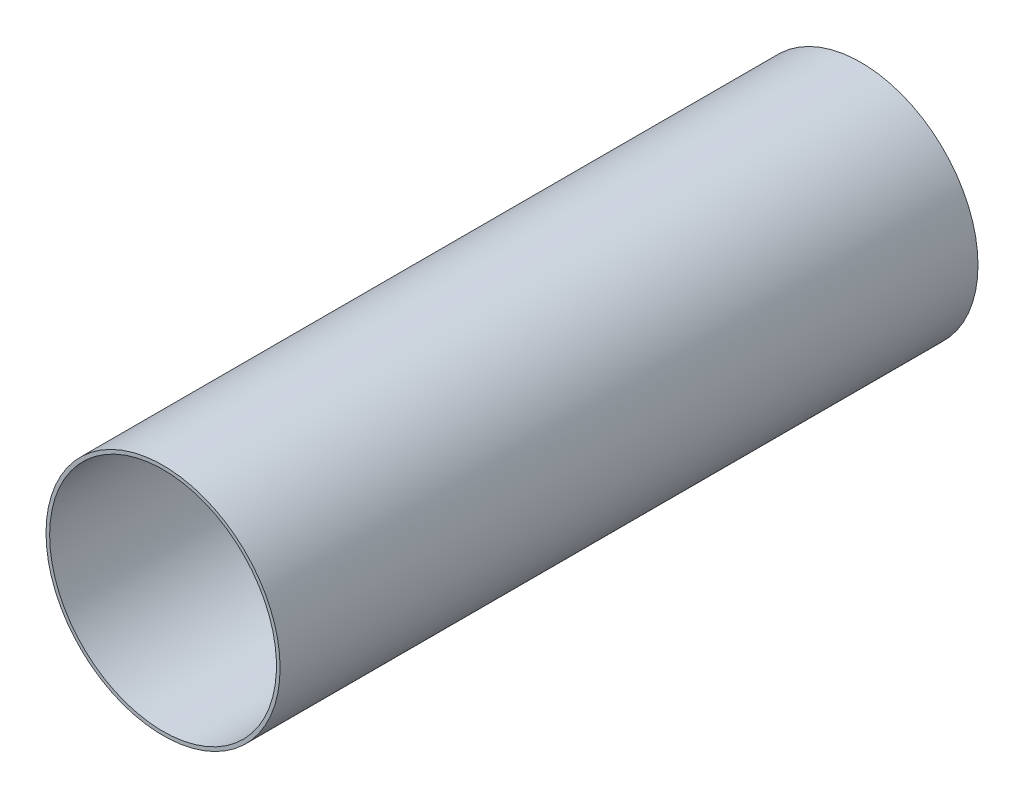
ISO-10303-21;
HEADER;
FILE_DESCRIPTION(('STEP AP214'),'2;1');
FILE_NAME('part.step','',(''),(''),'','','');
FILE_SCHEMA(('AUTOMOTIVE_DESIGN { 1 0 10303 214 1 1 1 1 }'));
ENDSEC;
DATA;
#1=APPLICATION_CONTEXT('core data for automotive mechanical design processes');
#2=APPLICATION_PROTOCOL_DEFINITION('international standard','automotive_design',2000,#1);
#3=PRODUCT_CONTEXT('',#1,'mechanical');
#4=PRODUCT('Part','Part','',(#3));
#5=PRODUCT_RELATED_PRODUCT_CATEGORY('part','',(#4));
#6=PRODUCT_DEFINITION_FORMATION('','',#4);
#7=PRODUCT_DEFINITION_CONTEXT('part definition',#1,'design');
#8=PRODUCT_DEFINITION('design','',#6,#7);
#9=PRODUCT_DEFINITION_SHAPE('','',#8);
#10=(LENGTH_UNIT() NAMED_UNIT(*) SI_UNIT(.MILLI.,.METRE.));
#11=(NAMED_UNIT(*) PLANE_ANGLE_UNIT() SI_UNIT($,.RADIAN.));
#12=(NAMED_UNIT(*) SI_UNIT($,.STERADIAN.) SOLID_ANGLE_UNIT());
#13=UNCERTAINTY_MEASURE_WITH_UNIT(LENGTH_MEASURE(1.E-05),#10,'distance_accuracy_value','');
#14=(GEOMETRIC_REPRESENTATION_CONTEXT(3) GLOBAL_UNCERTAINTY_ASSIGNED_CONTEXT((#13)) GLOBAL_UNIT_ASSIGNED_CONTEXT((#10,
#11,#12)) REPRESENTATION_CONTEXT('',''));
#15=CARTESIAN_POINT('',(0.,0.,0.));
#16=DIRECTION('',(0.,0.,1.));
#17=DIRECTION('',(1.,0.,0.));
#18=AXIS2_PLACEMENT_3D('',#15,#16,#17);
#19=CARTESIAN_POINT('',(0.,0.,304.8));
#20=DIRECTION('',(0.,0.,1.));
#21=DIRECTION('',(1.,0.,0.));
#22=AXIS2_PLACEMENT_3D('',#19,#20,#21);
#23=PLANE('',#22);
#24=CARTESIAN_POINT('',(0.,0.,304.8));
#25=DIRECTION('',(0.,0.,1.));
#26=DIRECTION('',(1.,0.,0.));
#27=AXIS2_PLACEMENT_3D('',#24,#25,#26);
#28=CIRCLE('',#27,51.1175);
#29=CARTESIAN_POINT('',(-51.1175,0.,304.8));
#30=VERTEX_POINT('',#29);
#31=EDGE_CURVE('E10',#30,#30,#28,.T.);
#32=ORIENTED_EDGE('',*,*,#31,.T.);
#33=EDGE_LOOP('',(#32));
#34=FACE_BOUND('',#33,.T.);
#35=CARTESIAN_POINT('',(0.,0.,304.8));
#36=DIRECTION('',(0.,0.,1.));
#37=DIRECTION('',(1.,0.,0.));
#38=AXIS2_PLACEMENT_3D('',#35,#36,#37);
#39=CIRCLE('',#38,49.53);
#40=CARTESIAN_POINT('',(-49.53,0.,304.8));
#41=VERTEX_POINT('',#40);
#42=EDGE_CURVE('E42',#41,#41,#39,.T.);
#43=ORIENTED_EDGE('',*,*,#42,.F.);
#44=EDGE_LOOP('',(#43));
#45=FACE_BOUND('',#44,.T.);
#46=ADVANCED_FACE('F31',(#34,#45),#23,.T.);
#47=CARTESIAN_POINT('',(0.,0.,0.));
#48=DIRECTION('',(0.,0.,1.));
#49=DIRECTION('',(1.,0.,0.));
#50=AXIS2_PLACEMENT_3D('',#47,#48,#49);
#51=PLANE('',#50);
#52=CARTESIAN_POINT('',(0.,0.,0.));
#53=DIRECTION('',(0.,0.,1.));
#54=DIRECTION('',(1.,0.,0.));
#55=AXIS2_PLACEMENT_3D('',#52,#53,#54);
#56=CIRCLE('',#55,51.1175);
#57=CARTESIAN_POINT('',(-51.1175,0.,0.));
#58=VERTEX_POINT('',#57);
#59=EDGE_CURVE('E35',#58,#58,#56,.T.);
#60=ORIENTED_EDGE('',*,*,#59,.F.);
#61=EDGE_LOOP('',(#60));
#62=FACE_BOUND('',#61,.T.);
#63=CARTESIAN_POINT('',(0.,0.,0.));
#64=DIRECTION('',(0.,0.,1.));
#65=DIRECTION('',(1.,0.,0.));
#66=AXIS2_PLACEMENT_3D('',#63,#64,#65);
#67=CIRCLE('',#66,49.53);
#68=CARTESIAN_POINT('',(-49.53,0.,0.));
#69=VERTEX_POINT('',#68);
#70=EDGE_CURVE('E44',#69,#69,#67,.T.);
#71=ORIENTED_EDGE('',*,*,#70,.T.);
#72=EDGE_LOOP('',(#71));
#73=FACE_BOUND('',#72,.T.);
#74=ADVANCED_FACE('F54',(#62,#73),#51,.F.);
#75=CARTESIAN_POINT('',(0.,0.,304.8));
#76=DIRECTION('',(0.,0.,-1.));
#77=DIRECTION('',(-1.,0.,0.));
#78=AXIS2_PLACEMENT_3D('',#75,#76,#77);
#79=CYLINDRICAL_SURFACE('',#78,51.1175);
#80=CARTESIAN_POINT('',(-51.1175,0.,304.8));
#81=CARTESIAN_POINT('',(-51.1175,0.,301.625));
#82=CARTESIAN_POINT('',(-51.1175,0.,298.45));
#83=CARTESIAN_POINT('',(-51.1175,0.,292.1));
#84=CARTESIAN_POINT('',(-51.1175,0.,288.925));
#85=CARTESIAN_POINT('',(-51.1175,0.,282.575));
#86=CARTESIAN_POINT('',(-51.1175,0.,279.4));
#87=CARTESIAN_POINT('',(-51.1175,0.,273.05));
#88=CARTESIAN_POINT('',(-51.1175,0.,269.875));
#89=CARTESIAN_POINT('',(-51.1175,0.,263.525));
#90=CARTESIAN_POINT('',(-51.1175,0.,260.35));
#91=CARTESIAN_POINT('',(-51.1175,0.,254.));
#92=CARTESIAN_POINT('',(-51.1175,0.,250.825));
#93=CARTESIAN_POINT('',(-51.1175,0.,244.475));
#94=CARTESIAN_POINT('',(-51.1175,0.,241.3));
#95=CARTESIAN_POINT('',(-51.1175,0.,234.95));
#96=CARTESIAN_POINT('',(-51.1175,0.,231.775));
#97=CARTESIAN_POINT('',(-51.1175,0.,225.425));
#98=CARTESIAN_POINT('',(-51.1175,0.,222.25));
#99=CARTESIAN_POINT('',(-51.1175,0.,215.9));
#100=CARTESIAN_POINT('',(-51.1175,0.,212.725));
#101=CARTESIAN_POINT('',(-51.1175,0.,206.375));
#102=CARTESIAN_POINT('',(-51.1175,0.,203.2));
#103=CARTESIAN_POINT('',(-51.1175,0.,196.85));
#104=CARTESIAN_POINT('',(-51.1175,0.,193.675));
#105=CARTESIAN_POINT('',(-51.1175,0.,187.325));
#106=CARTESIAN_POINT('',(-51.1175,0.,184.15));
#107=CARTESIAN_POINT('',(-51.1175,0.,177.8));
#108=CARTESIAN_POINT('',(-51.1175,0.,174.625));
#109=CARTESIAN_POINT('',(-51.1175,0.,168.275));
#110=CARTESIAN_POINT('',(-51.1175,0.,165.1));
#111=CARTESIAN_POINT('',(-51.1175,0.,158.75));
#112=CARTESIAN_POINT('',(-51.1175,0.,155.575));
#113=CARTESIAN_POINT('',(-51.1175,0.,149.225));
#114=CARTESIAN_POINT('',(-51.1175,0.,146.05));
#115=CARTESIAN_POINT('',(-51.1175,0.,139.7));
#116=CARTESIAN_POINT('',(-51.1175,0.,136.525));
#117=CARTESIAN_POINT('',(-51.1175,0.,130.175));
#118=CARTESIAN_POINT('',(-51.1175,0.,127.));
#119=CARTESIAN_POINT('',(-51.1175,0.,120.65));
#120=CARTESIAN_POINT('',(-51.1175,0.,117.475));
#121=CARTESIAN_POINT('',(-51.1175,0.,111.125));
#122=CARTESIAN_POINT('',(-51.1175,0.,107.95));
#123=CARTESIAN_POINT('',(-51.1175,0.,101.6));
#124=CARTESIAN_POINT('',(-51.1175,0.,98.425));
#125=CARTESIAN_POINT('',(-51.1175,0.,92.075));
#126=CARTESIAN_POINT('',(-51.1175,0.,88.9));
#127=CARTESIAN_POINT('',(-51.1175,0.,82.55));
#128=CARTESIAN_POINT('',(-51.1175,0.,79.375));
#129=CARTESIAN_POINT('',(-51.1175,0.,73.025));
#130=CARTESIAN_POINT('',(-51.1175,0.,69.85));
#131=CARTESIAN_POINT('',(-51.1175,0.,63.5));
#132=CARTESIAN_POINT('',(-51.1175,0.,60.325));
#133=CARTESIAN_POINT('',(-51.1175,0.,53.975));
#134=CARTESIAN_POINT('',(-51.1175,0.,50.8));
#135=CARTESIAN_POINT('',(-51.1175,0.,44.45));
#136=CARTESIAN_POINT('',(-51.1175,0.,41.275));
#137=CARTESIAN_POINT('',(-51.1175,0.,34.925));
#138=CARTESIAN_POINT('',(-51.1175,0.,31.75));
#139=CARTESIAN_POINT('',(-51.1175,0.,25.4));
#140=CARTESIAN_POINT('',(-51.1175,0.,22.225));
#141=CARTESIAN_POINT('',(-51.1175,0.,15.875));
#142=CARTESIAN_POINT('',(-51.1175,0.,12.7));
#143=CARTESIAN_POINT('',(-51.1175,0.,6.35));
#144=CARTESIAN_POINT('',(-51.1175,0.,3.175));
#145=CARTESIAN_POINT('',(-51.1175,0.,0.));
#146=B_SPLINE_CURVE_WITH_KNOTS('',3,(#80,#81,#82,#83,#84,#85,#86,#87,#88,#89,#90,#91,#92,#93,
#94,#95,#96,#97,#98,#99,#100,#101,#102,#103,#104,#105,#106,#107,#108,#109,#110,#111,#112,#113,
#114,#115,#116,#117,#118,#119,#120,#121,#122,#123,#124,#125,#126,#127,#128,#129,#130,#131,#132,
#133,#134,#135,#136,#137,#138,#139,#140,#141,#142,#143,#144,#145),.UNSPECIFIED.,.F.,.F.,(4,2,2,
2,2,2,2,2,2,2,2,2,2,2,2,2,2,2,2,2,2,2,2,2,2,2,2,2,2,2,2,2,4),(0.,9.52499999999995,19.05,28.575,
38.1,47.625,57.15,66.675,76.2,85.725,95.2499999999999,104.775,114.3,123.825,133.35,142.875,
152.4,161.925,171.45,180.975,190.5,200.025,209.55,219.075,228.6,238.125,247.65,257.175,266.7,
276.225,285.75,295.275,304.8),.UNSPECIFIED.);
#147=EDGE_CURVE('BSEAM33',#30,#58,#146,.T.);
#148=ORIENTED_EDGE('',*,*,#31,.F.);
#149=ORIENTED_EDGE('',*,*,#59,.T.);
#150=ORIENTED_EDGE('',*,*,#147,.T.);
#151=ORIENTED_EDGE('',*,*,#147,.F.);
#152=EDGE_LOOP('',(#148,#150,#149,#151));
#153=FACE_BOUND('',#152,.T.);
#154=ADVANCED_FACE('F33',(#153),#79,.T.);
#155=CARTESIAN_POINT('',(0.,0.,304.8));
#156=DIRECTION('',(0.,0.,-1.));
#157=DIRECTION('',(-1.,0.,0.));
#158=AXIS2_PLACEMENT_3D('',#155,#156,#157);
#159=CYLINDRICAL_SURFACE('',#158,49.53);
#160=CARTESIAN_POINT('',(-49.53,0.,304.8));
#161=CARTESIAN_POINT('',(-49.53,0.,301.625));
#162=CARTESIAN_POINT('',(-49.53,0.,298.45));
#163=CARTESIAN_POINT('',(-49.53,0.,292.1));
#164=CARTESIAN_POINT('',(-49.53,0.,288.925));
#165=CARTESIAN_POINT('',(-49.53,0.,282.575));
#166=CARTESIAN_POINT('',(-49.53,0.,279.4));
#167=CARTESIAN_POINT('',(-49.53,0.,273.05));
#168=CARTESIAN_POINT('',(-49.53,0.,269.875));
#169=CARTESIAN_POINT('',(-49.53,0.,263.525));
#170=CARTESIAN_POINT('',(-49.53,0.,260.35));
#171=CARTESIAN_POINT('',(-49.53,0.,254.));
#172=CARTESIAN_POINT('',(-49.53,0.,250.825));
#173=CARTESIAN_POINT('',(-49.53,0.,244.475));
#174=CARTESIAN_POINT('',(-49.53,0.,241.3));
#175=CARTESIAN_POINT('',(-49.53,0.,234.95));
#176=CARTESIAN_POINT('',(-49.53,0.,231.775));
#177=CARTESIAN_POINT('',(-49.53,0.,225.425));
#178=CARTESIAN_POINT('',(-49.53,0.,222.25));
#179=CARTESIAN_POINT('',(-49.53,0.,215.9));
#180=CARTESIAN_POINT('',(-49.53,0.,212.725));
#181=CARTESIAN_POINT('',(-49.53,0.,206.375));
#182=CARTESIAN_POINT('',(-49.53,0.,203.2));
#183=CARTESIAN_POINT('',(-49.53,0.,196.85));
#184=CARTESIAN_POINT('',(-49.53,0.,193.675));
#185=CARTESIAN_POINT('',(-49.53,0.,187.325));
#186=CARTESIAN_POINT('',(-49.53,0.,184.15));
#187=CARTESIAN_POINT('',(-49.53,0.,177.8));
#188=CARTESIAN_POINT('',(-49.53,0.,174.625));
#189=CARTESIAN_POINT('',(-49.53,0.,168.275));
#190=CARTESIAN_POINT('',(-49.53,0.,165.1));
#191=CARTESIAN_POINT('',(-49.53,0.,158.75));
#192=CARTESIAN_POINT('',(-49.53,0.,155.575));
#193=CARTESIAN_POINT('',(-49.53,0.,149.225));
#194=CARTESIAN_POINT('',(-49.53,0.,146.05));
#195=CARTESIAN_POINT('',(-49.53,0.,139.7));
#196=CARTESIAN_POINT('',(-49.53,0.,136.525));
#197=CARTESIAN_POINT('',(-49.53,0.,130.175));
#198=CARTESIAN_POINT('',(-49.53,0.,127.));
#199=CARTESIAN_POINT('',(-49.53,0.,120.65));
#200=CARTESIAN_POINT('',(-49.53,0.,117.475));
#201=CARTESIAN_POINT('',(-49.53,0.,111.125));
#202=CARTESIAN_POINT('',(-49.53,0.,107.95));
#203=CARTESIAN_POINT('',(-49.53,0.,101.6));
#204=CARTESIAN_POINT('',(-49.53,0.,98.425));
#205=CARTESIAN_POINT('',(-49.53,0.,92.075));
#206=CARTESIAN_POINT('',(-49.53,0.,88.9));
#207=CARTESIAN_POINT('',(-49.53,0.,82.55));
#208=CARTESIAN_POINT('',(-49.53,0.,79.375));
#209=CARTESIAN_POINT('',(-49.53,0.,73.025));
#210=CARTESIAN_POINT('',(-49.53,0.,69.85));
#211=CARTESIAN_POINT('',(-49.53,0.,63.5));
#212=CARTESIAN_POINT('',(-49.53,0.,60.325));
#213=CARTESIAN_POINT('',(-49.53,0.,53.975));
#214=CARTESIAN_POINT('',(-49.53,0.,50.8));
#215=CARTESIAN_POINT('',(-49.53,0.,44.45));
#216=CARTESIAN_POINT('',(-49.53,0.,41.275));
#217=CARTESIAN_POINT('',(-49.53,0.,34.925));
#218=CARTESIAN_POINT('',(-49.53,0.,31.75));
#219=CARTESIAN_POINT('',(-49.53,0.,25.4));
#220=CARTESIAN_POINT('',(-49.53,0.,22.225));
#221=CARTESIAN_POINT('',(-49.53,0.,15.875));
#222=CARTESIAN_POINT('',(-49.53,0.,12.7));
#223=CARTESIAN_POINT('',(-49.53,0.,6.35));
#224=CARTESIAN_POINT('',(-49.53,0.,3.175));
#225=CARTESIAN_POINT('',(-49.53,0.,0.));
#226=B_SPLINE_CURVE_WITH_KNOTS('',3,(#160,#161,#162,#163,#164,#165,#166,#167,#168,#169,#170,
#171,#172,#173,#174,#175,#176,#177,#178,#179,#180,#181,#182,#183,#184,#185,#186,#187,#188,#189,
#190,#191,#192,#193,#194,#195,#196,#197,#198,#199,#200,#201,#202,#203,#204,#205,#206,#207,#208,
#209,#210,#211,#212,#213,#214,#215,#216,#217,#218,#219,#220,#221,#222,#223,#224,#225),
.UNSPECIFIED.,.F.,.F.,(4,2,2,2,2,2,2,2,2,2,2,2,2,2,2,2,2,2,2,2,2,2,2,2,2,2,2,2,2,2,2,2,4),(0.,
9.52499999999995,19.05,28.575,38.1,47.625,57.15,66.675,76.2,85.725,95.2499999999999,104.775,
114.3,123.825,133.35,142.875,152.4,161.925,171.45,180.975,190.5,200.025,209.55,219.075,228.6,
238.125,247.65,257.175,266.7,276.225,285.75,295.275,304.8),.UNSPECIFIED.);
#227=EDGE_CURVE('BSEAM50',#41,#69,#226,.T.);
#228=ORIENTED_EDGE('',*,*,#42,.T.);
#229=ORIENTED_EDGE('',*,*,#70,.F.);
#230=ORIENTED_EDGE('',*,*,#227,.T.);
#231=ORIENTED_EDGE('',*,*,#227,.F.);
#232=EDGE_LOOP('',(#228,#230,#229,#231));
#233=FACE_BOUND('',#232,.T.);
#234=ADVANCED_FACE('F50',(#233),#159,.F.);
#235=CLOSED_SHELL('',(#46,#74,#154,#234));
#236=MANIFOLD_SOLID_BREP('B2',#235);
#237=ADVANCED_BREP_SHAPE_REPRESENTATION('',(#18,#236),#14);
#238=SHAPE_DEFINITION_REPRESENTATION(#9,#237);
ENDSEC;
END-ISO-10303-21;
